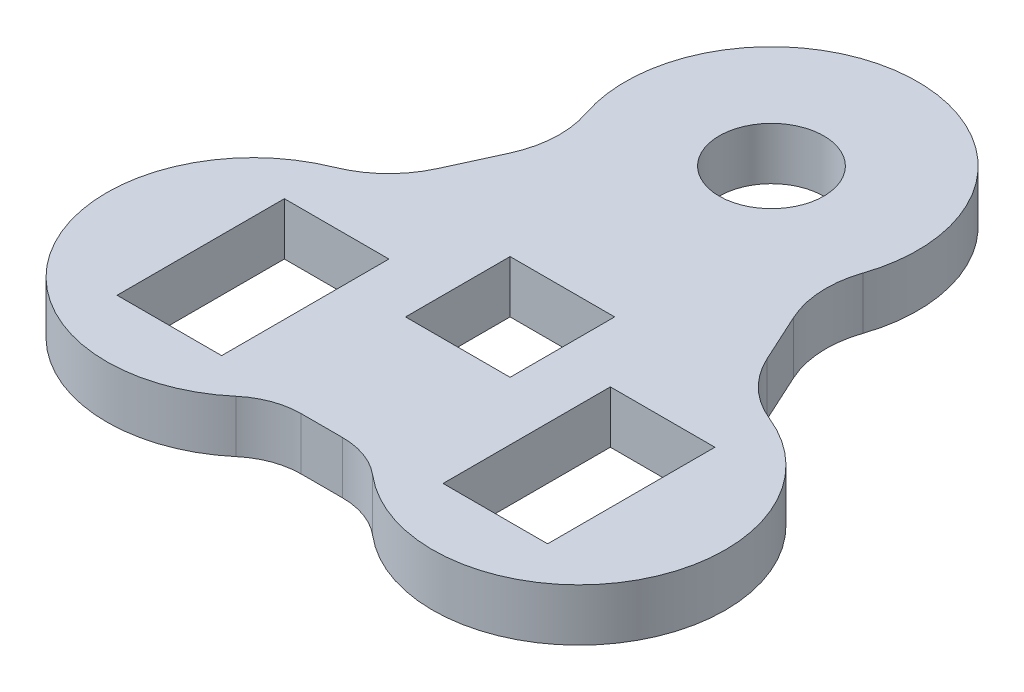
ISO-10303-21;
HEADER;
FILE_DESCRIPTION(('STEP AP214'),'2;1');
FILE_NAME('part.step','',(''),(''),'','','');
FILE_SCHEMA(('AUTOMOTIVE_DESIGN { 1 0 10303 214 1 1 1 1 }'));
ENDSEC;
DATA;
#1=APPLICATION_CONTEXT('core data for automotive mechanical design processes');
#2=APPLICATION_PROTOCOL_DEFINITION('international standard','automotive_design',2000,#1);
#3=PRODUCT_CONTEXT('',#1,'mechanical');
#4=PRODUCT('Part','Part','',(#3));
#5=PRODUCT_RELATED_PRODUCT_CATEGORY('part','',(#4));
#6=PRODUCT_DEFINITION_FORMATION('','',#4);
#7=PRODUCT_DEFINITION_CONTEXT('part definition',#1,'design');
#8=PRODUCT_DEFINITION('design','',#6,#7);
#9=PRODUCT_DEFINITION_SHAPE('','',#8);
#10=(LENGTH_UNIT() NAMED_UNIT(*) SI_UNIT(.MILLI.,.METRE.));
#11=(NAMED_UNIT(*) PLANE_ANGLE_UNIT() SI_UNIT($,.RADIAN.));
#12=(NAMED_UNIT(*) SI_UNIT($,.STERADIAN.) SOLID_ANGLE_UNIT());
#13=UNCERTAINTY_MEASURE_WITH_UNIT(LENGTH_MEASURE(1.E-05),#10,'distance_accuracy_value','');
#14=(GEOMETRIC_REPRESENTATION_CONTEXT(3) GLOBAL_UNCERTAINTY_ASSIGNED_CONTEXT((#13)) GLOBAL_UNIT_ASSIGNED_CONTEXT((#10,
#11,#12)) REPRESENTATION_CONTEXT('',''));
#15=CARTESIAN_POINT('',(0.,0.,0.));
#16=DIRECTION('',(0.,0.,1.));
#17=DIRECTION('',(1.,0.,0.));
#18=AXIS2_PLACEMENT_3D('',#15,#16,#17);
#19=CARTESIAN_POINT('',(-221.796823691982,50.,-174.689529607714));
#20=DIRECTION('',(0.,1.,0.));
#21=DIRECTION('',(0.,0.,1.));
#22=AXIS2_PLACEMENT_3D('',#19,#20,#21);
#23=PLANE('',#22);
#24=DIRECTION('',(0.,0.,1.));
#25=VECTOR('',#24,1.);
#26=CARTESIAN_POINT('',(-105.884572681199,50.,9.99999999999965));
#27=LINE('',#26,#25);
#28=CARTESIAN_POINT('',(-105.884572681199,50.,9.99999999999965));
#29=VERTEX_POINT('',#28);
#30=CARTESIAN_POINT('',(-105.884572681199,50.,170.));
#31=VERTEX_POINT('',#30);
#32=EDGE_CURVE('E573',#29,#31,#27,.T.);
#33=ORIENTED_EDGE('',*,*,#32,.T.);
#34=DIRECTION('',(1.,0.,0.));
#35=VECTOR('',#34,1.);
#36=CARTESIAN_POINT('',(-205.884572681199,50.,170.));
#37=LINE('',#36,#35);
#38=CARTESIAN_POINT('',(-205.884572681199,50.,170.));
#39=VERTEX_POINT('',#38);
#40=EDGE_CURVE('E571',#39,#31,#37,.T.);
#41=ORIENTED_EDGE('',*,*,#40,.F.);
#42=DIRECTION('',(0.,0.,1.));
#43=VECTOR('',#42,1.);
#44=CARTESIAN_POINT('',(-205.884572681199,50.,9.99999999999965));
#45=LINE('',#44,#43);
#46=CARTESIAN_POINT('',(-205.884572681199,50.,9.99999999999965));
#47=VERTEX_POINT('',#46);
#48=EDGE_CURVE('E580',#47,#39,#45,.T.);
#49=ORIENTED_EDGE('',*,*,#48,.F.);
#50=DIRECTION('',(1.,0.,0.));
#51=VECTOR('',#50,1.);
#52=CARTESIAN_POINT('',(-205.884572681199,50.,9.99999999999965));
#53=LINE('',#52,#51);
#54=EDGE_CURVE('E577',#47,#29,#53,.T.);
#55=ORIENTED_EDGE('',*,*,#54,.T.);
#56=EDGE_LOOP('',(#33,#41,#49,#55));
#57=FACE_BOUND('',#56,.T.);
#58=CARTESIAN_POINT('',(-221.796823691982,50.,-174.689529607714));
#59=DIRECTION('',(0.,1.,0.));
#60=DIRECTION('',(0.,0.,1.));
#61=AXIS2_PLACEMENT_3D('',#58,#59,#60);
#62=CIRCLE('',#61,94.4482589041679);
#63=CARTESIAN_POINT('',(-135.95822426265,50.,-135.291452775976));
#64=VERTEX_POINT('',#63);
#65=CARTESIAN_POINT('',(-132.363449529558,50.,-205.056373301991));
#66=VERTEX_POINT('',#65);
#67=EDGE_CURVE('E602',#64,#66,#62,.T.);
#68=ORIENTED_EDGE('',*,*,#67,.F.);
#69=DIRECTION('',(0.417139260044103,0.,-0.908842581380218));
#70=VECTOR('',#69,1.);
#71=CARTESIAN_POINT('',(-157.631299989059,50.,-88.071217290215));
#72=LINE('',#71,#70);
#73=CARTESIAN_POINT('',(-157.631299989059,50.,-88.071217290215));
#74=VERTEX_POINT('',#73);
#75=EDGE_CURVE('E629',#74,#64,#72,.T.);
#76=ORIENTED_EDGE('',*,*,#75,.F.);
#77=CARTESIAN_POINT('',(-243.469899418391,50.,-127.469294121953));
#78=DIRECTION('',(0.,-1.,0.));
#79=DIRECTION('',(0.,0.,-1.));
#80=AXIS2_PLACEMENT_3D('',#77,#78,#79);
#81=CIRCLE('',#80,94.448258904168);
#82=CARTESIAN_POINT('',(-208.185249239894,50.,-39.8595511032125));
#83=VERTEX_POINT('',#82);
#84=EDGE_CURVE('E627',#74,#83,#81,.T.);
#85=ORIENTED_EDGE('',*,*,#84,.T.);
#86=CARTESIAN_POINT('',(-155.884572681199,50.,89.9999999999997));
#87=DIRECTION('',(0.,1.,0.));
#88=DIRECTION('',(0.,0.,1.));
#89=AXIS2_PLACEMENT_3D('',#86,#87,#88);
#90=CIRCLE('',#89,139.995942016992);
#91=CARTESIAN_POINT('',(-65.2528596645249,50.,196.699373835501));
#92=VERTEX_POINT('',#91);
#93=EDGE_CURVE('E625',#83,#92,#90,.T.);
#94=ORIENTED_EDGE('',*,*,#93,.T.);
#95=CARTESIAN_POINT('',(-19.7979392424659,50.,250.212778639887));
#96=DIRECTION('',(0.,1.,0.));
#97=DIRECTION('',(0.,0.,1.));
#98=AXIS2_PLACEMENT_3D('',#95,#96,#97);
#99=CIRCLE('',#98,70.2127786398873);
#100=CARTESIAN_POINT('',(-19.7979392424659,50.,180.));
#101=VERTEX_POINT('',#100);
#102=EDGE_CURVE('E622',#101,#92,#99,.T.);
#103=ORIENTED_EDGE('',*,*,#102,.F.);
#104=DIRECTION('',(-1.,0.,0.));
#105=VECTOR('',#104,1.);
#106=CARTESIAN_POINT('',(19.7979392424659,50.,180.));
#107=LINE('',#106,#105);
#108=CARTESIAN_POINT('',(19.7979392424659,50.,180.));
#109=VERTEX_POINT('',#108);
#110=EDGE_CURVE('E619',#109,#101,#107,.T.);
#111=ORIENTED_EDGE('',*,*,#110,.F.);
#112=CARTESIAN_POINT('',(19.7979392424659,50.,250.212778639887));
#113=DIRECTION('',(0.,-1.,0.));
#114=DIRECTION('',(0.,0.,-1.));
#115=AXIS2_PLACEMENT_3D('',#112,#113,#114);
#116=CIRCLE('',#115,70.2127786398873);
#117=CARTESIAN_POINT('',(65.2528596645249,50.,196.699373835501));
#118=VERTEX_POINT('',#117);
#119=EDGE_CURVE('E617',#109,#118,#116,.T.);
#120=ORIENTED_EDGE('',*,*,#119,.T.);
#121=CARTESIAN_POINT('',(155.884572681199,50.,89.9999999999996));
#122=DIRECTION('',(0.,1.,0.));
#123=DIRECTION('',(0.,0.,1.));
#124=AXIS2_PLACEMENT_3D('',#121,#122,#123);
#125=CIRCLE('',#124,139.995942016992);
#126=CARTESIAN_POINT('',(208.185249239894,50.,-39.8595511032125));
#127=VERTEX_POINT('',#126);
#128=EDGE_CURVE('E615',#118,#127,#125,.T.);
#129=ORIENTED_EDGE('',*,*,#128,.T.);
#130=CARTESIAN_POINT('',(243.469899418391,50.,-127.469294121953));
#131=DIRECTION('',(0.,1.,0.));
#132=DIRECTION('',(0.,0.,1.));
#133=AXIS2_PLACEMENT_3D('',#130,#131,#132);
#134=CIRCLE('',#133,94.4482589041679);
#135=CARTESIAN_POINT('',(157.631299989059,50.,-88.071217290215));
#136=VERTEX_POINT('',#135);
#137=EDGE_CURVE('E612',#136,#127,#134,.T.);
#138=ORIENTED_EDGE('',*,*,#137,.F.);
#139=DIRECTION('',(0.417139260044093,0.,0.908842581380222));
#140=VECTOR('',#139,1.);
#141=CARTESIAN_POINT('',(135.95822426265,50.,-135.291452775976));
#142=LINE('',#141,#140);
#143=CARTESIAN_POINT('',(135.95822426265,50.,-135.291452775976));
#144=VERTEX_POINT('',#143);
#145=EDGE_CURVE('E610',#144,#136,#142,.T.);
#146=ORIENTED_EDGE('',*,*,#145,.F.);
#147=CARTESIAN_POINT('',(221.796823691982,50.,-174.689529607714));
#148=DIRECTION('',(0.,-1.,0.));
#149=DIRECTION('',(0.,0.,-1.));
#150=AXIS2_PLACEMENT_3D('',#147,#148,#149);
#151=CIRCLE('',#150,94.4482589041679);
#152=CARTESIAN_POINT('',(132.363449529558,50.,-205.056373301991));
#153=VERTEX_POINT('',#152);
#154=EDGE_CURVE('E608',#144,#153,#151,.T.);
#155=ORIENTED_EDGE('',*,*,#154,.T.);
#156=CARTESIAN_POINT('',(0.,50.,-250.));
#157=DIRECTION('',(0.,1.,0.));
#158=DIRECTION('',(0.,0.,1.));
#159=AXIS2_PLACEMENT_3D('',#156,#157,#158);
#160=CIRCLE('',#159,139.785594222487);
#161=EDGE_CURVE('E605',#153,#66,#160,.T.);
#162=ORIENTED_EDGE('',*,*,#161,.T.);
#163=EDGE_LOOP('',(#68,#76,#85,#94,#103,#111,#120,#129,#138,#146,#155,#162));
#164=FACE_BOUND('',#163,.T.);
#165=DIRECTION('',(0.,0.,1.));
#166=VECTOR('',#165,1.);
#167=CARTESIAN_POINT('',(205.884572681199,50.,9.99999999999965));
#168=LINE('',#167,#166);
#169=CARTESIAN_POINT('',(205.884572681199,50.,9.99999999999965));
#170=VERTEX_POINT('',#169);
#171=CARTESIAN_POINT('',(205.884572681199,50.,170.));
#172=VERTEX_POINT('',#171);
#173=EDGE_CURVE('E540',#170,#172,#168,.T.);
#174=ORIENTED_EDGE('',*,*,#173,.T.);
#175=DIRECTION('',(-1.,0.,0.));
#176=VECTOR('',#175,1.);
#177=CARTESIAN_POINT('',(205.884572681199,50.,170.));
#178=LINE('',#177,#176);
#179=CARTESIAN_POINT('',(105.884572681199,50.,170.));
#180=VERTEX_POINT('',#179);
#181=EDGE_CURVE('E543',#172,#180,#178,.T.);
#182=ORIENTED_EDGE('',*,*,#181,.T.);
#183=DIRECTION('',(0.,0.,1.));
#184=VECTOR('',#183,1.);
#185=CARTESIAN_POINT('',(105.884572681199,50.,9.99999999999965));
#186=LINE('',#185,#184);
#187=CARTESIAN_POINT('',(105.884572681199,50.,9.99999999999965));
#188=VERTEX_POINT('',#187);
#189=EDGE_CURVE('E547',#188,#180,#186,.T.);
#190=ORIENTED_EDGE('',*,*,#189,.F.);
#191=DIRECTION('',(-1.,0.,0.));
#192=VECTOR('',#191,1.);
#193=CARTESIAN_POINT('',(205.884572681199,50.,9.99999999999965));
#194=LINE('',#193,#192);
#195=EDGE_CURVE('E550',#170,#188,#194,.T.);
#196=ORIENTED_EDGE('',*,*,#195,.F.);
#197=EDGE_LOOP('',(#174,#182,#190,#196));
#198=FACE_BOUND('',#197,.T.);
#199=CARTESIAN_POINT('',(0.,50.,-250.));
#200=DIRECTION('',(0.,1.,0.));
#201=DIRECTION('',(0.,0.,1.));
#202=AXIS2_PLACEMENT_3D('',#199,#200,#201);
#203=CIRCLE('',#202,50.);
#204=CARTESIAN_POINT('',(0.,50.,-200.));
#205=VERTEX_POINT('',#204);
#206=EDGE_CURVE('E534',#205,#205,#203,.T.);
#207=ORIENTED_EDGE('',*,*,#206,.F.);
#208=EDGE_LOOP('',(#207));
#209=FACE_BOUND('',#208,.T.);
#210=DIRECTION('',(0.,0.,1.));
#211=VECTOR('',#210,1.);
#212=CARTESIAN_POINT('',(50.,50.,-50.));
#213=LINE('',#212,#211);
#214=CARTESIAN_POINT('',(50.,50.,-50.));
#215=VERTEX_POINT('',#214);
#216=CARTESIAN_POINT('',(49.9999999999999,50.,50.0000000000001));
#217=VERTEX_POINT('',#216);
#218=EDGE_CURVE('E507',#215,#217,#213,.T.);
#219=ORIENTED_EDGE('',*,*,#218,.T.);
#220=DIRECTION('',(1.,0.,0.));
#221=VECTOR('',#220,1.);
#222=CARTESIAN_POINT('',(-50.,50.,50.));
#223=LINE('',#222,#221);
#224=CARTESIAN_POINT('',(-50.,50.,50.));
#225=VERTEX_POINT('',#224);
#226=EDGE_CURVE('E498',#225,#217,#223,.T.);
#227=ORIENTED_EDGE('',*,*,#226,.F.);
#228=DIRECTION('',(0.,0.,1.));
#229=VECTOR('',#228,1.);
#230=CARTESIAN_POINT('',(-50.,50.,-50.));
#231=LINE('',#230,#229);
#232=CARTESIAN_POINT('',(-50.,50.,-50.));
#233=VERTEX_POINT('',#232);
#234=EDGE_CURVE('E519',#233,#225,#231,.T.);
#235=ORIENTED_EDGE('',*,*,#234,.F.);
#236=DIRECTION('',(1.,0.,0.));
#237=VECTOR('',#236,1.);
#238=CARTESIAN_POINT('',(-50.,50.,-50.));
#239=LINE('',#238,#237);
#240=EDGE_CURVE('E354',#233,#215,#239,.T.);
#241=ORIENTED_EDGE('',*,*,#240,.T.);
#242=EDGE_LOOP('',(#219,#227,#235,#241));
#243=FACE_BOUND('',#242,.T.);
#244=ADVANCED_FACE('F337',(#57,#164,#198,#209,#243),#23,.T.);
#245=CARTESIAN_POINT('',(-221.796823691982,0.,-174.689529607714));
#246=DIRECTION('',(0.,1.,0.));
#247=DIRECTION('',(0.,0.,1.));
#248=AXIS2_PLACEMENT_3D('',#245,#246,#247);
#249=PLANE('',#248);
#250=CARTESIAN_POINT('',(0.,0.,-250.));
#251=DIRECTION('',(0.,1.,0.));
#252=DIRECTION('',(0.,0.,1.));
#253=AXIS2_PLACEMENT_3D('',#250,#251,#252);
#254=CIRCLE('',#253,50.);
#255=CARTESIAN_POINT('',(0.,0.,-200.));
#256=VERTEX_POINT('',#255);
#257=EDGE_CURVE('E515',#256,#256,#254,.T.);
#258=ORIENTED_EDGE('',*,*,#257,.T.);
#259=EDGE_LOOP('',(#258));
#260=FACE_BOUND('',#259,.T.);
#261=DIRECTION('',(1.,0.,0.));
#262=VECTOR('',#261,1.);
#263=CARTESIAN_POINT('',(-205.884572681199,0.,170.));
#264=LINE('',#263,#262);
#265=CARTESIAN_POINT('',(-205.884572681199,0.,170.));
#266=VERTEX_POINT('',#265);
#267=CARTESIAN_POINT('',(-105.884572681199,0.,170.));
#268=VERTEX_POINT('',#267);
#269=EDGE_CURVE('E564',#266,#268,#264,.T.);
#270=ORIENTED_EDGE('',*,*,#269,.T.);
#271=DIRECTION('',(0.,0.,1.));
#272=VECTOR('',#271,1.);
#273=CARTESIAN_POINT('',(-105.884572681199,0.,9.99999999999965));
#274=LINE('',#273,#272);
#275=CARTESIAN_POINT('',(-105.884572681199,0.,9.99999999999965));
#276=VERTEX_POINT('',#275);
#277=EDGE_CURVE('E585',#276,#268,#274,.T.);
#278=ORIENTED_EDGE('',*,*,#277,.F.);
#279=DIRECTION('',(1.,0.,0.));
#280=VECTOR('',#279,1.);
#281=CARTESIAN_POINT('',(-205.884572681199,0.,9.99999999999965));
#282=LINE('',#281,#280);
#283=CARTESIAN_POINT('',(-205.884572681199,0.,9.99999999999965));
#284=VERTEX_POINT('',#283);
#285=EDGE_CURVE('E588',#284,#276,#282,.T.);
#286=ORIENTED_EDGE('',*,*,#285,.F.);
#287=DIRECTION('',(0.,0.,1.));
#288=VECTOR('',#287,1.);
#289=CARTESIAN_POINT('',(-205.884572681199,0.,9.99999999999965));
#290=LINE('',#289,#288);
#291=EDGE_CURVE('E574',#284,#266,#290,.T.);
#292=ORIENTED_EDGE('',*,*,#291,.T.);
#293=EDGE_LOOP('',(#270,#278,#286,#292));
#294=FACE_BOUND('',#293,.T.);
#295=CARTESIAN_POINT('',(-221.796823691982,0.,-174.689529607714));
#296=DIRECTION('',(0.,1.,0.));
#297=DIRECTION('',(0.,0.,1.));
#298=AXIS2_PLACEMENT_3D('',#295,#296,#297);
#299=CIRCLE('',#298,94.4482589041679);
#300=CARTESIAN_POINT('',(-135.95822426265,0.,-135.291452775976));
#301=VERTEX_POINT('',#300);
#302=CARTESIAN_POINT('',(-132.363449529558,0.,-205.056373301991));
#303=VERTEX_POINT('',#302);
#304=EDGE_CURVE('E601',#301,#303,#299,.T.);
#305=ORIENTED_EDGE('',*,*,#304,.T.);
#306=CARTESIAN_POINT('',(0.,0.,-250.));
#307=DIRECTION('',(0.,1.,0.));
#308=DIRECTION('',(0.,0.,1.));
#309=AXIS2_PLACEMENT_3D('',#306,#307,#308);
#310=CIRCLE('',#309,139.785594222487);
#311=CARTESIAN_POINT('',(132.363449529558,0.,-205.056373301991));
#312=VERTEX_POINT('',#311);
#313=EDGE_CURVE('E633',#312,#303,#310,.T.);
#314=ORIENTED_EDGE('',*,*,#313,.F.);
#315=CARTESIAN_POINT('',(221.796823691982,0.,-174.689529607714));
#316=DIRECTION('',(0.,-1.,0.));
#317=DIRECTION('',(0.,0.,-1.));
#318=AXIS2_PLACEMENT_3D('',#315,#316,#317);
#319=CIRCLE('',#318,94.4482589041679);
#320=CARTESIAN_POINT('',(135.95822426265,0.,-135.291452775976));
#321=VERTEX_POINT('',#320);
#322=EDGE_CURVE('E636',#321,#312,#319,.T.);
#323=ORIENTED_EDGE('',*,*,#322,.F.);
#324=DIRECTION('',(-0.417139260044103,0.,-0.908842581380218));
#325=VECTOR('',#324,1.);
#326=CARTESIAN_POINT('',(157.631299989059,0.,-88.071217290215));
#327=LINE('',#326,#325);
#328=CARTESIAN_POINT('',(157.631299989059,0.,-88.071217290215));
#329=VERTEX_POINT('',#328);
#330=EDGE_CURVE('E638',#329,#321,#327,.T.);
#331=ORIENTED_EDGE('',*,*,#330,.F.);
#332=CARTESIAN_POINT('',(243.469899418391,0.,-127.469294121953));
#333=DIRECTION('',(0.,1.,0.));
#334=DIRECTION('',(0.,0.,1.));
#335=AXIS2_PLACEMENT_3D('',#332,#333,#334);
#336=CIRCLE('',#335,94.4482589041679);
#337=CARTESIAN_POINT('',(208.185249239894,0.,-39.8595511032125));
#338=VERTEX_POINT('',#337);
#339=EDGE_CURVE('E640',#329,#338,#336,.T.);
#340=ORIENTED_EDGE('',*,*,#339,.T.);
#341=CARTESIAN_POINT('',(155.884572681199,0.,89.9999999999996));
#342=DIRECTION('',(0.,1.,0.));
#343=DIRECTION('',(0.,0.,1.));
#344=AXIS2_PLACEMENT_3D('',#341,#342,#343);
#345=CIRCLE('',#344,139.995942016992);
#346=CARTESIAN_POINT('',(65.2528596645249,0.,196.699373835501));
#347=VERTEX_POINT('',#346);
#348=EDGE_CURVE('E643',#347,#338,#345,.T.);
#349=ORIENTED_EDGE('',*,*,#348,.F.);
#350=CARTESIAN_POINT('',(19.7979392424659,0.,250.212778639887));
#351=DIRECTION('',(0.,-1.,0.));
#352=DIRECTION('',(0.,0.,-1.));
#353=AXIS2_PLACEMENT_3D('',#350,#351,#352);
#354=CIRCLE('',#353,70.2127786398873);
#355=CARTESIAN_POINT('',(19.7979392424659,0.,180.));
#356=VERTEX_POINT('',#355);
#357=EDGE_CURVE('E646',#356,#347,#354,.T.);
#358=ORIENTED_EDGE('',*,*,#357,.F.);
#359=DIRECTION('',(-1.,0.,0.));
#360=VECTOR('',#359,1.);
#361=CARTESIAN_POINT('',(19.7979392424659,0.,180.));
#362=LINE('',#361,#360);
#363=CARTESIAN_POINT('',(-19.7979392424659,0.,180.));
#364=VERTEX_POINT('',#363);
#365=EDGE_CURVE('E648',#356,#364,#362,.T.);
#366=ORIENTED_EDGE('',*,*,#365,.T.);
#367=CARTESIAN_POINT('',(-19.7979392424659,0.,250.212778639887));
#368=DIRECTION('',(0.,1.,0.));
#369=DIRECTION('',(0.,0.,1.));
#370=AXIS2_PLACEMENT_3D('',#367,#368,#369);
#371=CIRCLE('',#370,70.2127786398873);
#372=CARTESIAN_POINT('',(-65.2528596645249,0.,196.699373835501));
#373=VERTEX_POINT('',#372);
#374=EDGE_CURVE('E651',#364,#373,#371,.T.);
#375=ORIENTED_EDGE('',*,*,#374,.T.);
#376=CARTESIAN_POINT('',(-155.884572681199,0.,89.9999999999997));
#377=DIRECTION('',(0.,1.,0.));
#378=DIRECTION('',(0.,0.,1.));
#379=AXIS2_PLACEMENT_3D('',#376,#377,#378);
#380=CIRCLE('',#379,139.995942016992);
#381=CARTESIAN_POINT('',(-208.185249239894,0.,-39.8595511032125));
#382=VERTEX_POINT('',#381);
#383=EDGE_CURVE('E654',#382,#373,#380,.T.);
#384=ORIENTED_EDGE('',*,*,#383,.F.);
#385=CARTESIAN_POINT('',(-243.469899418391,0.,-127.469294121953));
#386=DIRECTION('',(0.,-1.,0.));
#387=DIRECTION('',(0.,0.,-1.));
#388=AXIS2_PLACEMENT_3D('',#385,#386,#387);
#389=CIRCLE('',#388,94.448258904168);
#390=CARTESIAN_POINT('',(-157.631299989059,0.,-88.071217290215));
#391=VERTEX_POINT('',#390);
#392=EDGE_CURVE('E657',#391,#382,#389,.T.);
#393=ORIENTED_EDGE('',*,*,#392,.F.);
#394=DIRECTION('',(-0.417139260044093,0.,0.908842581380222));
#395=VECTOR('',#394,1.);
#396=CARTESIAN_POINT('',(-135.95822426265,0.,-135.291452775976));
#397=LINE('',#396,#395);
#398=EDGE_CURVE('E606',#301,#391,#397,.T.);
#399=ORIENTED_EDGE('',*,*,#398,.F.);
#400=EDGE_LOOP('',(#305,#314,#323,#331,#340,#349,#358,#366,#375,#384,#393,#399));
#401=FACE_BOUND('',#400,.T.);
#402=DIRECTION('',(-1.,0.,0.));
#403=VECTOR('',#402,1.);
#404=CARTESIAN_POINT('',(205.884572681199,0.,170.));
#405=LINE('',#404,#403);
#406=CARTESIAN_POINT('',(205.884572681199,0.,170.));
#407=VERTEX_POINT('',#406);
#408=CARTESIAN_POINT('',(105.884572681199,0.,170.));
#409=VERTEX_POINT('',#408);
#410=EDGE_CURVE('E554',#407,#409,#405,.T.);
#411=ORIENTED_EDGE('',*,*,#410,.F.);
#412=DIRECTION('',(0.,0.,1.));
#413=VECTOR('',#412,1.);
#414=CARTESIAN_POINT('',(205.884572681199,0.,9.99999999999965));
#415=LINE('',#414,#413);
#416=CARTESIAN_POINT('',(205.884572681199,0.,9.99999999999965));
#417=VERTEX_POINT('',#416);
#418=EDGE_CURVE('E537',#417,#407,#415,.T.);
#419=ORIENTED_EDGE('',*,*,#418,.F.);
#420=DIRECTION('',(-1.,0.,0.));
#421=VECTOR('',#420,1.);
#422=CARTESIAN_POINT('',(205.884572681199,0.,9.99999999999965));
#423=LINE('',#422,#421);
#424=CARTESIAN_POINT('',(105.884572681199,0.,9.99999999999965));
#425=VERTEX_POINT('',#424);
#426=EDGE_CURVE('E544',#417,#425,#423,.T.);
#427=ORIENTED_EDGE('',*,*,#426,.T.);
#428=DIRECTION('',(0.,0.,1.));
#429=VECTOR('',#428,1.);
#430=CARTESIAN_POINT('',(105.884572681199,0.,9.99999999999965));
#431=LINE('',#430,#429);
#432=EDGE_CURVE('E557',#425,#409,#431,.T.);
#433=ORIENTED_EDGE('',*,*,#432,.T.);
#434=EDGE_LOOP('',(#411,#419,#427,#433));
#435=FACE_BOUND('',#434,.T.);
#436=DIRECTION('',(1.,0.,0.));
#437=VECTOR('',#436,1.);
#438=CARTESIAN_POINT('',(-50.,0.,50.));
#439=LINE('',#438,#437);
#440=CARTESIAN_POINT('',(-50.,0.,50.));
#441=VERTEX_POINT('',#440);
#442=CARTESIAN_POINT('',(49.9999999999999,0.,50.0000000000001));
#443=VERTEX_POINT('',#442);
#444=EDGE_CURVE('E362',#441,#443,#439,.T.);
#445=ORIENTED_EDGE('',*,*,#444,.T.);
#446=DIRECTION('',(0.,0.,1.));
#447=VECTOR('',#446,1.);
#448=CARTESIAN_POINT('',(50.,0.,-50.));
#449=LINE('',#448,#447);
#450=CARTESIAN_POINT('',(50.,0.,-50.));
#451=VERTEX_POINT('',#450);
#452=EDGE_CURVE('E514',#451,#443,#449,.T.);
#453=ORIENTED_EDGE('',*,*,#452,.F.);
#454=DIRECTION('',(1.,0.,0.));
#455=VECTOR('',#454,1.);
#456=CARTESIAN_POINT('',(-50.,0.,-50.));
#457=LINE('',#456,#455);
#458=CARTESIAN_POINT('',(-50.,0.,-50.));
#459=VERTEX_POINT('',#458);
#460=EDGE_CURVE('E525',#459,#451,#457,.T.);
#461=ORIENTED_EDGE('',*,*,#460,.F.);
#462=DIRECTION('',(0.,0.,1.));
#463=VECTOR('',#462,1.);
#464=CARTESIAN_POINT('',(-50.,0.,-50.));
#465=LINE('',#464,#463);
#466=EDGE_CURVE('E508',#459,#441,#465,.T.);
#467=ORIENTED_EDGE('',*,*,#466,.T.);
#468=EDGE_LOOP('',(#445,#453,#461,#467));
#469=FACE_BOUND('',#468,.T.);
#470=ADVANCED_FACE('F695',(#260,#294,#401,#435,#469),#249,.F.);
#471=CARTESIAN_POINT('',(-221.796823691982,50.,-174.689529607714));
#472=DIRECTION('',(0.,-1.,0.));
#473=DIRECTION('',(0.,0.,-1.));
#474=AXIS2_PLACEMENT_3D('',#471,#472,#473);
#475=CYLINDRICAL_SURFACE('',#474,94.4482589041679);
#476=ORIENTED_EDGE('',*,*,#304,.F.);
#477=DIRECTION('',(0.,-1.,0.));
#478=VECTOR('',#477,1.);
#479=CARTESIAN_POINT('',(-135.95822426265,50.,-135.291452775976));
#480=LINE('',#479,#478);
#481=EDGE_CURVE('E265',#64,#301,#480,.T.);
#482=ORIENTED_EDGE('',*,*,#481,.F.);
#483=ORIENTED_EDGE('',*,*,#67,.T.);
#484=DIRECTION('',(0.,-1.,0.));
#485=VECTOR('',#484,1.);
#486=CARTESIAN_POINT('',(-132.363449529558,50.,-205.056373301991));
#487=LINE('',#486,#485);
#488=EDGE_CURVE('E341',#66,#303,#487,.T.);
#489=ORIENTED_EDGE('',*,*,#488,.T.);
#490=EDGE_LOOP('',(#476,#482,#483,#489));
#491=FACE_BOUND('',#490,.T.);
#492=ADVANCED_FACE('F339',(#491),#475,.F.);
#493=CARTESIAN_POINT('',(-135.95822426265,50.,-135.291452775976));
#494=DIRECTION('',(0.908842581380223,0.,0.417139260044093));
#495=DIRECTION('',(0.417139260044093,0.,-0.908842581380223));
#496=AXIS2_PLACEMENT_3D('',#493,#494,#495);
#497=PLANE('',#496);
#498=ORIENTED_EDGE('',*,*,#398,.T.);
#499=DIRECTION('',(0.,-1.,0.));
#500=VECTOR('',#499,1.);
#501=CARTESIAN_POINT('',(-157.631299989059,50.,-88.071217290215));
#502=LINE('',#501,#500);
#503=EDGE_CURVE('E346',#74,#391,#502,.T.);
#504=ORIENTED_EDGE('',*,*,#503,.F.);
#505=ORIENTED_EDGE('',*,*,#75,.T.);
#506=ORIENTED_EDGE('',*,*,#481,.T.);
#507=EDGE_LOOP('',(#498,#504,#505,#506));
#508=FACE_BOUND('',#507,.T.);
#509=ADVANCED_FACE('F700',(#508),#497,.F.);
#510=CARTESIAN_POINT('',(-243.469899418391,50.,-127.469294121953));
#511=DIRECTION('',(0.,-1.,0.));
#512=DIRECTION('',(0.,0.,-1.));
#513=AXIS2_PLACEMENT_3D('',#510,#511,#512);
#514=CYLINDRICAL_SURFACE('',#513,94.448258904168);
#515=ORIENTED_EDGE('',*,*,#392,.T.);
#516=DIRECTION('',(0.,-1.,0.));
#517=VECTOR('',#516,1.);
#518=CARTESIAN_POINT('',(-208.185249239894,50.,-39.8595511032125));
#519=LINE('',#518,#517);
#520=EDGE_CURVE('E662',#83,#382,#519,.T.);
#521=ORIENTED_EDGE('',*,*,#520,.F.);
#522=ORIENTED_EDGE('',*,*,#84,.F.);
#523=ORIENTED_EDGE('',*,*,#503,.T.);
#524=EDGE_LOOP('',(#515,#521,#522,#523));
#525=FACE_BOUND('',#524,.T.);
#526=ADVANCED_FACE('F703',(#525),#514,.F.);
#527=CARTESIAN_POINT('',(-155.884572681199,50.,89.9999999999997));
#528=DIRECTION('',(0.,-1.,0.));
#529=DIRECTION('',(0.,0.,-1.));
#530=AXIS2_PLACEMENT_3D('',#527,#528,#529);
#531=CYLINDRICAL_SURFACE('',#530,139.995942016992);
#532=ORIENTED_EDGE('',*,*,#383,.T.);
#533=DIRECTION('',(0.,-1.,0.));
#534=VECTOR('',#533,1.);
#535=CARTESIAN_POINT('',(-65.2528596645249,50.,196.699373835501));
#536=LINE('',#535,#534);
#537=EDGE_CURVE('E665',#92,#373,#536,.T.);
#538=ORIENTED_EDGE('',*,*,#537,.F.);
#539=ORIENTED_EDGE('',*,*,#93,.F.);
#540=ORIENTED_EDGE('',*,*,#520,.T.);
#541=EDGE_LOOP('',(#532,#538,#539,#540));
#542=FACE_BOUND('',#541,.T.);
#543=ADVANCED_FACE('F739',(#542),#531,.T.);
#544=CARTESIAN_POINT('',(-19.7979392424659,50.,250.212778639887));
#545=DIRECTION('',(0.,-1.,0.));
#546=DIRECTION('',(0.,0.,-1.));
#547=AXIS2_PLACEMENT_3D('',#544,#545,#546);
#548=CYLINDRICAL_SURFACE('',#547,70.2127786398873);
#549=ORIENTED_EDGE('',*,*,#374,.F.);
#550=DIRECTION('',(0.,-1.,0.));
#551=VECTOR('',#550,1.);
#552=CARTESIAN_POINT('',(-19.7979392424659,50.,180.));
#553=LINE('',#552,#551);
#554=EDGE_CURVE('E667',#101,#364,#553,.T.);
#555=ORIENTED_EDGE('',*,*,#554,.F.);
#556=ORIENTED_EDGE('',*,*,#102,.T.);
#557=ORIENTED_EDGE('',*,*,#537,.T.);
#558=EDGE_LOOP('',(#549,#555,#556,#557));
#559=FACE_BOUND('',#558,.T.);
#560=ADVANCED_FACE('F736',(#559),#548,.F.);
#561=CARTESIAN_POINT('',(19.7979392424659,50.,180.));
#562=DIRECTION('',(0.,0.,1.));
#563=DIRECTION('',(1.,0.,0.));
#564=AXIS2_PLACEMENT_3D('',#561,#562,#563);
#565=PLANE('',#564);
#566=ORIENTED_EDGE('',*,*,#365,.F.);
#567=DIRECTION('',(0.,-1.,0.));
#568=VECTOR('',#567,1.);
#569=CARTESIAN_POINT('',(19.7979392424659,50.,180.));
#570=LINE('',#569,#568);
#571=EDGE_CURVE('E669',#109,#356,#570,.T.);
#572=ORIENTED_EDGE('',*,*,#571,.F.);
#573=ORIENTED_EDGE('',*,*,#110,.T.);
#574=ORIENTED_EDGE('',*,*,#554,.T.);
#575=EDGE_LOOP('',(#566,#572,#573,#574));
#576=FACE_BOUND('',#575,.T.);
#577=ADVANCED_FACE('F730',(#576),#565,.T.);
#578=CARTESIAN_POINT('',(19.7979392424659,50.,250.212778639887));
#579=DIRECTION('',(0.,-1.,0.));
#580=DIRECTION('',(0.,0.,-1.));
#581=AXIS2_PLACEMENT_3D('',#578,#579,#580);
#582=CYLINDRICAL_SURFACE('',#581,70.2127786398873);
#583=ORIENTED_EDGE('',*,*,#357,.T.);
#584=DIRECTION('',(0.,-1.,0.));
#585=VECTOR('',#584,1.);
#586=CARTESIAN_POINT('',(65.2528596645249,50.,196.699373835501));
#587=LINE('',#586,#585);
#588=EDGE_CURVE('E671',#118,#347,#587,.T.);
#589=ORIENTED_EDGE('',*,*,#588,.F.);
#590=ORIENTED_EDGE('',*,*,#119,.F.);
#591=ORIENTED_EDGE('',*,*,#571,.T.);
#592=EDGE_LOOP('',(#583,#589,#590,#591));
#593=FACE_BOUND('',#592,.T.);
#594=ADVANCED_FACE('F740',(#593),#582,.F.);
#595=CARTESIAN_POINT('',(155.884572681199,50.,89.9999999999996));
#596=DIRECTION('',(0.,-1.,0.));
#597=DIRECTION('',(0.,0.,-1.));
#598=AXIS2_PLACEMENT_3D('',#595,#596,#597);
#599=CYLINDRICAL_SURFACE('',#598,139.995942016992);
#600=ORIENTED_EDGE('',*,*,#348,.T.);
#601=DIRECTION('',(0.,-1.,0.));
#602=VECTOR('',#601,1.);
#603=CARTESIAN_POINT('',(208.185249239894,50.,-39.8595511032125));
#604=LINE('',#603,#602);
#605=EDGE_CURVE('E674',#127,#338,#604,.T.);
#606=ORIENTED_EDGE('',*,*,#605,.F.);
#607=ORIENTED_EDGE('',*,*,#128,.F.);
#608=ORIENTED_EDGE('',*,*,#588,.T.);
#609=EDGE_LOOP('',(#600,#606,#607,#608));
#610=FACE_BOUND('',#609,.T.);
#611=ADVANCED_FACE('F724',(#610),#599,.T.);
#612=CARTESIAN_POINT('',(243.469899418391,50.,-127.469294121953));
#613=DIRECTION('',(0.,-1.,0.));
#614=DIRECTION('',(0.,0.,-1.));
#615=AXIS2_PLACEMENT_3D('',#612,#613,#614);
#616=CYLINDRICAL_SURFACE('',#615,94.4482589041679);
#617=ORIENTED_EDGE('',*,*,#339,.F.);
#618=DIRECTION('',(0.,-1.,0.));
#619=VECTOR('',#618,1.);
#620=CARTESIAN_POINT('',(157.631299989059,50.,-88.071217290215));
#621=LINE('',#620,#619);
#622=EDGE_CURVE('E676',#136,#329,#621,.T.);
#623=ORIENTED_EDGE('',*,*,#622,.F.);
#624=ORIENTED_EDGE('',*,*,#137,.T.);
#625=ORIENTED_EDGE('',*,*,#605,.T.);
#626=EDGE_LOOP('',(#617,#623,#624,#625));
#627=FACE_BOUND('',#626,.T.);
#628=ADVANCED_FACE('F720',(#627),#616,.F.);
#629=CARTESIAN_POINT('',(157.631299989059,50.,-88.071217290215));
#630=DIRECTION('',(-0.908842581380218,0.,0.417139260044103));
#631=DIRECTION('',(0.417139260044103,0.,0.908842581380218));
#632=AXIS2_PLACEMENT_3D('',#629,#630,#631);
#633=PLANE('',#632);
#634=ORIENTED_EDGE('',*,*,#330,.T.);
#635=DIRECTION('',(0.,-1.,0.));
#636=VECTOR('',#635,1.);
#637=CARTESIAN_POINT('',(135.95822426265,50.,-135.291452775976));
#638=LINE('',#637,#636);
#639=EDGE_CURVE('E678',#144,#321,#638,.T.);
#640=ORIENTED_EDGE('',*,*,#639,.F.);
#641=ORIENTED_EDGE('',*,*,#145,.T.);
#642=ORIENTED_EDGE('',*,*,#622,.T.);
#643=EDGE_LOOP('',(#634,#640,#641,#642));
#644=FACE_BOUND('',#643,.T.);
#645=ADVANCED_FACE('F795',(#644),#633,.F.);
#646=CARTESIAN_POINT('',(221.796823691982,50.,-174.689529607714));
#647=DIRECTION('',(0.,-1.,0.));
#648=DIRECTION('',(0.,0.,-1.));
#649=AXIS2_PLACEMENT_3D('',#646,#647,#648);
#650=CYLINDRICAL_SURFACE('',#649,94.4482589041679);
#651=ORIENTED_EDGE('',*,*,#322,.T.);
#652=DIRECTION('',(0.,-1.,0.));
#653=VECTOR('',#652,1.);
#654=CARTESIAN_POINT('',(132.363449529558,50.,-205.056373301991));
#655=LINE('',#654,#653);
#656=EDGE_CURVE('E680',#153,#312,#655,.T.);
#657=ORIENTED_EDGE('',*,*,#656,.F.);
#658=ORIENTED_EDGE('',*,*,#154,.F.);
#659=ORIENTED_EDGE('',*,*,#639,.T.);
#660=EDGE_LOOP('',(#651,#657,#658,#659));
#661=FACE_BOUND('',#660,.T.);
#662=ADVANCED_FACE('F713',(#661),#650,.F.);
#663=CARTESIAN_POINT('',(0.,50.,-250.));
#664=DIRECTION('',(0.,-1.,0.));
#665=DIRECTION('',(0.,0.,-1.));
#666=AXIS2_PLACEMENT_3D('',#663,#664,#665);
#667=CYLINDRICAL_SURFACE('',#666,139.785594222487);
#668=ORIENTED_EDGE('',*,*,#313,.T.);
#669=ORIENTED_EDGE('',*,*,#488,.F.);
#670=ORIENTED_EDGE('',*,*,#161,.F.);
#671=ORIENTED_EDGE('',*,*,#656,.T.);
#672=EDGE_LOOP('',(#668,#669,#670,#671));
#673=FACE_BOUND('',#672,.T.);
#674=ADVANCED_FACE('F691',(#673),#667,.T.);
#675=CARTESIAN_POINT('',(-205.884572681199,50.,170.));
#676=DIRECTION('',(0.,0.,-1.));
#677=DIRECTION('',(-1.,0.,0.));
#678=AXIS2_PLACEMENT_3D('',#675,#676,#677);
#679=PLANE('',#678);
#680=ORIENTED_EDGE('',*,*,#269,.F.);
#681=DIRECTION('',(0.,-1.,0.));
#682=VECTOR('',#681,1.);
#683=CARTESIAN_POINT('',(-205.884572681199,50.,170.));
#684=LINE('',#683,#682);
#685=EDGE_CURVE('E582',#39,#266,#684,.T.);
#686=ORIENTED_EDGE('',*,*,#685,.F.);
#687=ORIENTED_EDGE('',*,*,#40,.T.);
#688=DIRECTION('',(0.,-1.,0.));
#689=VECTOR('',#688,1.);
#690=CARTESIAN_POINT('',(-105.884572681199,50.,170.));
#691=LINE('',#690,#689);
#692=EDGE_CURVE('E599',#31,#268,#691,.T.);
#693=ORIENTED_EDGE('',*,*,#692,.T.);
#694=EDGE_LOOP('',(#680,#686,#687,#693));
#695=FACE_BOUND('',#694,.T.);
#696=ADVANCED_FACE('F758',(#695),#679,.T.);
#697=CARTESIAN_POINT('',(-105.884572681199,50.,9.99999999999965));
#698=DIRECTION('',(1.,0.,0.));
#699=DIRECTION('',(0.,0.,-1.));
#700=AXIS2_PLACEMENT_3D('',#697,#698,#699);
#701=PLANE('',#700);
#702=ORIENTED_EDGE('',*,*,#277,.T.);
#703=ORIENTED_EDGE('',*,*,#692,.F.);
#704=ORIENTED_EDGE('',*,*,#32,.F.);
#705=DIRECTION('',(0.,-1.,0.));
#706=VECTOR('',#705,1.);
#707=CARTESIAN_POINT('',(-105.884572681199,50.,9.99999999999965));
#708=LINE('',#707,#706);
#709=EDGE_CURVE('E597',#29,#276,#708,.T.);
#710=ORIENTED_EDGE('',*,*,#709,.T.);
#711=EDGE_LOOP('',(#702,#703,#704,#710));
#712=FACE_BOUND('',#711,.T.);
#713=ADVANCED_FACE('F828',(#712),#701,.F.);
#714=CARTESIAN_POINT('',(-205.884572681199,50.,9.99999999999965));
#715=DIRECTION('',(0.,0.,-1.));
#716=DIRECTION('',(-1.,0.,0.));
#717=AXIS2_PLACEMENT_3D('',#714,#715,#716);
#718=PLANE('',#717);
#719=ORIENTED_EDGE('',*,*,#285,.T.);
#720=ORIENTED_EDGE('',*,*,#709,.F.);
#721=ORIENTED_EDGE('',*,*,#54,.F.);
#722=DIRECTION('',(0.,-1.,0.));
#723=VECTOR('',#722,1.);
#724=CARTESIAN_POINT('',(-205.884572681199,50.,9.99999999999965));
#725=LINE('',#724,#723);
#726=EDGE_CURVE('E595',#47,#284,#725,.T.);
#727=ORIENTED_EDGE('',*,*,#726,.T.);
#728=EDGE_LOOP('',(#719,#720,#721,#727));
#729=FACE_BOUND('',#728,.T.);
#730=ADVANCED_FACE('F837',(#729),#718,.F.);
#731=CARTESIAN_POINT('',(-205.884572681199,50.,9.99999999999965));
#732=DIRECTION('',(1.,0.,0.));
#733=DIRECTION('',(0.,0.,-1.));
#734=AXIS2_PLACEMENT_3D('',#731,#732,#733);
#735=PLANE('',#734);
#736=ORIENTED_EDGE('',*,*,#291,.F.);
#737=ORIENTED_EDGE('',*,*,#726,.F.);
#738=ORIENTED_EDGE('',*,*,#48,.T.);
#739=ORIENTED_EDGE('',*,*,#685,.T.);
#740=EDGE_LOOP('',(#736,#737,#738,#739));
#741=FACE_BOUND('',#740,.T.);
#742=ADVANCED_FACE('F846',(#741),#735,.T.);
#743=CARTESIAN_POINT('',(205.884572681199,50.,9.99999999999965));
#744=DIRECTION('',(1.,0.,0.));
#745=DIRECTION('',(0.,0.,-1.));
#746=AXIS2_PLACEMENT_3D('',#743,#744,#745);
#747=PLANE('',#746);
#748=ORIENTED_EDGE('',*,*,#418,.T.);
#749=DIRECTION('',(0.,-1.,0.));
#750=VECTOR('',#749,1.);
#751=CARTESIAN_POINT('',(205.884572681199,50.,170.));
#752=LINE('',#751,#750);
#753=EDGE_CURVE('E552',#172,#407,#752,.T.);
#754=ORIENTED_EDGE('',*,*,#753,.F.);
#755=ORIENTED_EDGE('',*,*,#173,.F.);
#756=DIRECTION('',(0.,-1.,0.));
#757=VECTOR('',#756,1.);
#758=CARTESIAN_POINT('',(205.884572681199,50.,9.99999999999965));
#759=LINE('',#758,#757);
#760=EDGE_CURVE('E562',#170,#417,#759,.T.);
#761=ORIENTED_EDGE('',*,*,#760,.T.);
#762=EDGE_LOOP('',(#748,#754,#755,#761));
#763=FACE_BOUND('',#762,.T.);
#764=ADVANCED_FACE('F856',(#763),#747,.F.);
#765=CARTESIAN_POINT('',(205.884572681199,50.,9.99999999999965));
#766=DIRECTION('',(0.,0.,1.));
#767=DIRECTION('',(1.,0.,0.));
#768=AXIS2_PLACEMENT_3D('',#765,#766,#767);
#769=PLANE('',#768);
#770=ORIENTED_EDGE('',*,*,#426,.F.);
#771=ORIENTED_EDGE('',*,*,#760,.F.);
#772=ORIENTED_EDGE('',*,*,#195,.T.);
#773=DIRECTION('',(0.,-1.,0.));
#774=VECTOR('',#773,1.);
#775=CARTESIAN_POINT('',(105.884572681199,50.,9.99999999999965));
#776=LINE('',#775,#774);
#777=EDGE_CURVE('E565',#188,#425,#776,.T.);
#778=ORIENTED_EDGE('',*,*,#777,.T.);
#779=EDGE_LOOP('',(#770,#771,#772,#778));
#780=FACE_BOUND('',#779,.T.);
#781=ADVANCED_FACE('F866',(#780),#769,.T.);
#782=CARTESIAN_POINT('',(105.884572681199,50.,9.99999999999965));
#783=DIRECTION('',(1.,0.,0.));
#784=DIRECTION('',(0.,0.,-1.));
#785=AXIS2_PLACEMENT_3D('',#782,#783,#784);
#786=PLANE('',#785);
#787=ORIENTED_EDGE('',*,*,#432,.F.);
#788=ORIENTED_EDGE('',*,*,#777,.F.);
#789=ORIENTED_EDGE('',*,*,#189,.T.);
#790=DIRECTION('',(0.,-1.,0.));
#791=VECTOR('',#790,1.);
#792=CARTESIAN_POINT('',(105.884572681199,50.,170.));
#793=LINE('',#792,#791);
#794=EDGE_CURVE('E567',#180,#409,#793,.T.);
#795=ORIENTED_EDGE('',*,*,#794,.T.);
#796=EDGE_LOOP('',(#787,#788,#789,#795));
#797=FACE_BOUND('',#796,.T.);
#798=ADVANCED_FACE('F876',(#797),#786,.T.);
#799=CARTESIAN_POINT('',(205.884572681199,50.,170.));
#800=DIRECTION('',(0.,0.,1.));
#801=DIRECTION('',(1.,0.,0.));
#802=AXIS2_PLACEMENT_3D('',#799,#800,#801);
#803=PLANE('',#802);
#804=ORIENTED_EDGE('',*,*,#410,.T.);
#805=ORIENTED_EDGE('',*,*,#794,.F.);
#806=ORIENTED_EDGE('',*,*,#181,.F.);
#807=ORIENTED_EDGE('',*,*,#753,.T.);
#808=EDGE_LOOP('',(#804,#805,#806,#807));
#809=FACE_BOUND('',#808,.T.);
#810=ADVANCED_FACE('F886',(#809),#803,.F.);
#811=CARTESIAN_POINT('',(0.,50.,-250.));
#812=DIRECTION('',(0.,-1.,0.));
#813=DIRECTION('',(0.,0.,-1.));
#814=AXIS2_PLACEMENT_3D('',#811,#812,#813);
#815=CYLINDRICAL_SURFACE('',#814,50.);
#816=ORIENTED_EDGE('',*,*,#206,.T.);
#817=EDGE_LOOP('',(#816));
#818=FACE_BOUND('',#817,.T.);
#819=ORIENTED_EDGE('',*,*,#257,.F.);
#820=EDGE_LOOP('',(#819));
#821=FACE_BOUND('',#820,.T.);
#822=ADVANCED_FACE('F896',(#818,#821),#815,.F.);
#823=CARTESIAN_POINT('',(-50.,50.,50.));
#824=DIRECTION('',(0.,0.,-1.));
#825=DIRECTION('',(-1.,0.,0.));
#826=AXIS2_PLACEMENT_3D('',#823,#824,#825);
#827=PLANE('',#826);
#828=ORIENTED_EDGE('',*,*,#444,.F.);
#829=DIRECTION('',(0.,-1.,0.));
#830=VECTOR('',#829,1.);
#831=CARTESIAN_POINT('',(-50.,50.,50.));
#832=LINE('',#831,#830);
#833=EDGE_CURVE('E503',#225,#441,#832,.T.);
#834=ORIENTED_EDGE('',*,*,#833,.F.);
#835=ORIENTED_EDGE('',*,*,#226,.T.);
#836=DIRECTION('',(0.,-1.,0.));
#837=VECTOR('',#836,1.);
#838=CARTESIAN_POINT('',(49.9999999999999,50.,50.0000000000001));
#839=LINE('',#838,#837);
#840=EDGE_CURVE('E501',#217,#443,#839,.T.);
#841=ORIENTED_EDGE('',*,*,#840,.T.);
#842=EDGE_LOOP('',(#828,#834,#835,#841));
#843=FACE_BOUND('',#842,.T.);
#844=ADVANCED_FACE('F500',(#843),#827,.T.);
#845=CARTESIAN_POINT('',(50.,50.,-50.));
#846=DIRECTION('',(1.,0.,0.));
#847=DIRECTION('',(0.,0.,-1.));
#848=AXIS2_PLACEMENT_3D('',#845,#846,#847);
#849=PLANE('',#848);
#850=ORIENTED_EDGE('',*,*,#452,.T.);
#851=ORIENTED_EDGE('',*,*,#840,.F.);
#852=ORIENTED_EDGE('',*,*,#218,.F.);
#853=DIRECTION('',(0.,-1.,0.));
#854=VECTOR('',#853,1.);
#855=CARTESIAN_POINT('',(50.,50.,-50.));
#856=LINE('',#855,#854);
#857=EDGE_CURVE('E516',#215,#451,#856,.T.);
#858=ORIENTED_EDGE('',*,*,#857,.T.);
#859=EDGE_LOOP('',(#850,#851,#852,#858));
#860=FACE_BOUND('',#859,.T.);
#861=ADVANCED_FACE('F512',(#860),#849,.F.);
#862=CARTESIAN_POINT('',(-50.,50.,-50.));
#863=DIRECTION('',(0.,0.,-1.));
#864=DIRECTION('',(-1.,0.,0.));
#865=AXIS2_PLACEMENT_3D('',#862,#863,#864);
#866=PLANE('',#865);
#867=ORIENTED_EDGE('',*,*,#460,.T.);
#868=ORIENTED_EDGE('',*,*,#857,.F.);
#869=ORIENTED_EDGE('',*,*,#240,.F.);
#870=DIRECTION('',(0.,-1.,0.));
#871=VECTOR('',#870,1.);
#872=CARTESIAN_POINT('',(-50.,50.,-50.));
#873=LINE('',#872,#871);
#874=EDGE_CURVE('E531',#233,#459,#873,.T.);
#875=ORIENTED_EDGE('',*,*,#874,.T.);
#876=EDGE_LOOP('',(#867,#868,#869,#875));
#877=FACE_BOUND('',#876,.T.);
#878=ADVANCED_FACE('F923',(#877),#866,.F.);
#879=CARTESIAN_POINT('',(-50.,50.,-50.));
#880=DIRECTION('',(1.,0.,0.));
#881=DIRECTION('',(0.,0.,-1.));
#882=AXIS2_PLACEMENT_3D('',#879,#880,#881);
#883=PLANE('',#882);
#884=ORIENTED_EDGE('',*,*,#466,.F.);
#885=ORIENTED_EDGE('',*,*,#874,.F.);
#886=ORIENTED_EDGE('',*,*,#234,.T.);
#887=ORIENTED_EDGE('',*,*,#833,.T.);
#888=EDGE_LOOP('',(#884,#885,#886,#887));
#889=FACE_BOUND('',#888,.T.);
#890=ADVANCED_FACE('F932',(#889),#883,.T.);
#891=CLOSED_SHELL('',(#244,#470,#492,#509,#526,#543,#560,#577,#594,#611,#628,#645,#662,#674,
#696,#713,#730,#742,#764,#781,#798,#810,#822,#844,#861,#878,#890));
#892=MANIFOLD_SOLID_BREP('B7',#891);
#893=ADVANCED_BREP_SHAPE_REPRESENTATION('',(#18,#892),#14);
#894=SHAPE_DEFINITION_REPRESENTATION(#9,#893);
ENDSEC;
END-ISO-10303-21;
